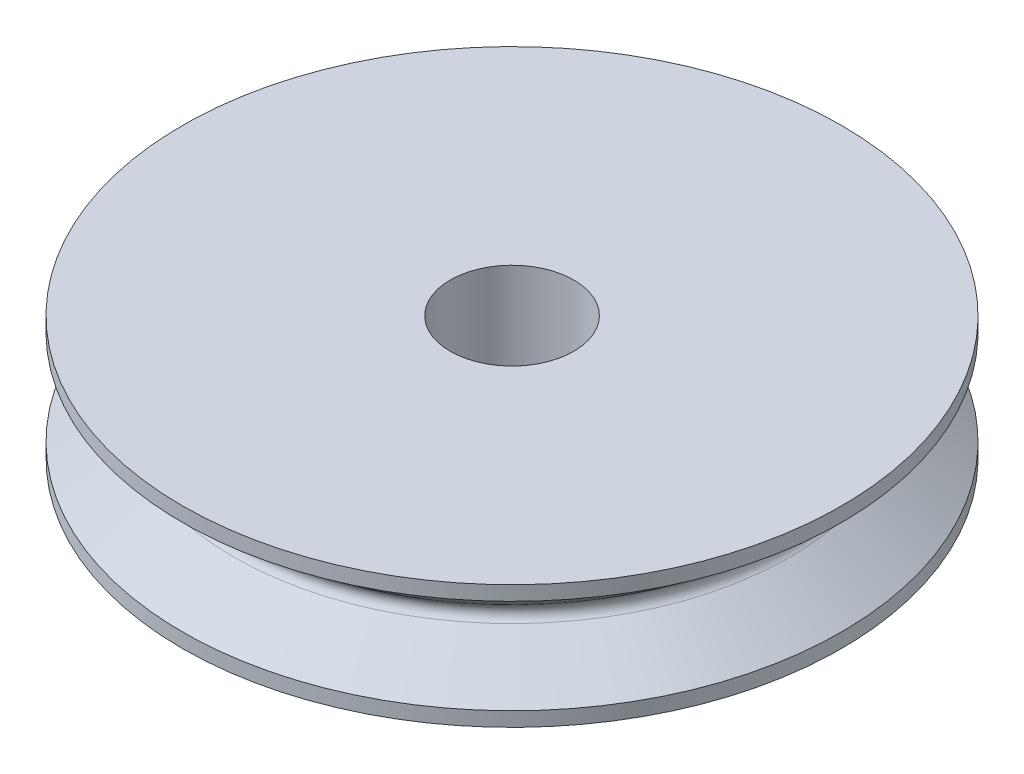
ISO-10303-21;
HEADER;
FILE_DESCRIPTION(('STEP AP214'),'2;1');
FILE_NAME('part.step','',(''),(''),'','','');
FILE_SCHEMA(('AUTOMOTIVE_DESIGN { 1 0 10303 214 1 1 1 1 }'));
ENDSEC;
DATA;
#1=APPLICATION_CONTEXT('core data for automotive mechanical design processes');
#2=APPLICATION_PROTOCOL_DEFINITION('international standard','automotive_design',2000,#1);
#3=PRODUCT_CONTEXT('',#1,'mechanical');
#4=PRODUCT('Part','Part','',(#3));
#5=PRODUCT_RELATED_PRODUCT_CATEGORY('part','',(#4));
#6=PRODUCT_DEFINITION_FORMATION('','',#4);
#7=PRODUCT_DEFINITION_CONTEXT('part definition',#1,'design');
#8=PRODUCT_DEFINITION('design','',#6,#7);
#9=PRODUCT_DEFINITION_SHAPE('','',#8);
#10=(LENGTH_UNIT() NAMED_UNIT(*) SI_UNIT(.MILLI.,.METRE.));
#11=(NAMED_UNIT(*) PLANE_ANGLE_UNIT() SI_UNIT($,.RADIAN.));
#12=(NAMED_UNIT(*) SI_UNIT($,.STERADIAN.) SOLID_ANGLE_UNIT());
#13=UNCERTAINTY_MEASURE_WITH_UNIT(LENGTH_MEASURE(1.E-05),#10,'distance_accuracy_value','');
#14=(GEOMETRIC_REPRESENTATION_CONTEXT(3) GLOBAL_UNCERTAINTY_ASSIGNED_CONTEXT((#13)) GLOBAL_UNIT_ASSIGNED_CONTEXT((#10,
#11,#12)) REPRESENTATION_CONTEXT('',''));
#15=CARTESIAN_POINT('',(0.,0.,0.));
#16=DIRECTION('',(0.,0.,1.));
#17=DIRECTION('',(1.,0.,0.));
#18=AXIS2_PLACEMENT_3D('',#15,#16,#17);
#19=CARTESIAN_POINT('',(0.,6.,0.));
#20=DIRECTION('',(0.,-1.,0.));
#21=DIRECTION('',(0.,0.,-1.));
#22=AXIS2_PLACEMENT_3D('',#19,#20,#21);
#23=CYLINDRICAL_SURFACE('',#22,16.);
#24=CARTESIAN_POINT('',(0.,0.7,0.));
#25=DIRECTION('',(0.,-1.,0.));
#26=DIRECTION('',(0.,0.,-1.));
#27=AXIS2_PLACEMENT_3D('',#24,#25,#26);
#28=CIRCLE('',#27,16.);
#29=CARTESIAN_POINT('',(0.,0.7,-16.));
#30=VERTEX_POINT('',#29);
#31=EDGE_CURVE('E39',#30,#30,#28,.T.);
#32=ORIENTED_EDGE('',*,*,#31,.T.);
#33=EDGE_LOOP('',(#32));
#34=FACE_BOUND('',#33,.T.);
#35=CARTESIAN_POINT('',(0.,0.,0.));
#36=DIRECTION('',(0.,1.,0.));
#37=DIRECTION('',(0.,0.,1.));
#38=AXIS2_PLACEMENT_3D('',#35,#36,#37);
#39=CIRCLE('',#38,16.);
#40=CARTESIAN_POINT('',(0.,0.,16.));
#41=VERTEX_POINT('',#40);
#42=EDGE_CURVE('E32',#41,#41,#39,.T.);
#43=ORIENTED_EDGE('',*,*,#42,.T.);
#44=EDGE_LOOP('',(#43));
#45=FACE_BOUND('',#44,.T.);
#46=ADVANCED_FACE('F28',(#34,#45),#23,.T.);
#47=CARTESIAN_POINT('',(0.,0.,0.));
#48=DIRECTION('',(0.,1.,0.));
#49=DIRECTION('',(0.,0.,1.));
#50=AXIS2_PLACEMENT_3D('',#47,#48,#49);
#51=PLANE('',#50);
#52=CARTESIAN_POINT('',(0.,0.,0.));
#53=DIRECTION('',(0.,1.,0.));
#54=DIRECTION('',(0.,0.,1.));
#55=AXIS2_PLACEMENT_3D('',#52,#53,#54);
#56=CIRCLE('',#55,3.);
#57=CARTESIAN_POINT('',(0.,0.,3.));
#58=VERTEX_POINT('',#57);
#59=EDGE_CURVE('E52',#58,#58,#56,.T.);
#60=ORIENTED_EDGE('',*,*,#59,.T.);
#61=EDGE_LOOP('',(#60));
#62=FACE_BOUND('',#61,.T.);
#63=ORIENTED_EDGE('',*,*,#42,.F.);
#64=EDGE_LOOP('',(#63));
#65=FACE_BOUND('',#64,.T.);
#66=ADVANCED_FACE('F59',(#62,#65),#51,.F.);
#67=CARTESIAN_POINT('',(0.,2.60261236958771,0.));
#68=DIRECTION('',(0.,-1.,0.));
#69=DIRECTION('',(0.,0.,-1.));
#70=AXIS2_PLACEMENT_3D('',#67,#68,#69);
#71=CONICAL_SURFACE('',#70,13.5084204212445,0.918637185248335);
#72=ORIENTED_EDGE('',*,*,#31,.F.);
#73=EDGE_LOOP('',(#72));
#74=FACE_BOUND('',#73,.T.);
#75=CARTESIAN_POINT('',(0.,2.60261236958771,0.));
#76=DIRECTION('',(0.,-1.,0.));
#77=DIRECTION('',(0.,0.,-1.));
#78=AXIS2_PLACEMENT_3D('',#75,#76,#77);
#79=CIRCLE('',#78,13.5084204212445);
#80=CARTESIAN_POINT('',(0.,2.60261236958771,-13.5084204212445));
#81=VERTEX_POINT('',#80);
#82=EDGE_CURVE('E43',#81,#81,#79,.T.);
#83=ORIENTED_EDGE('',*,*,#82,.T.);
#84=EDGE_LOOP('',(#83));
#85=FACE_BOUND('',#84,.T.);
#86=ADVANCED_FACE('F86',(#74,#85),#71,.T.);
#87=CARTESIAN_POINT('',(0.,3.,0.));
#88=DIRECTION('',(0.,-1.,0.));
#89=DIRECTION('',(0.,0.,-1.));
#90=AXIS2_PLACEMENT_3D('',#87,#88,#89);
#91=TOROIDAL_SURFACE('',#90,13.8118723469186,0.5);
#92=ORIENTED_EDGE('',*,*,#82,.F.);
#93=EDGE_LOOP('',(#92));
#94=FACE_BOUND('',#93,.T.);
#95=CARTESIAN_POINT('',(0.,3.39738763041229,0.));
#96=DIRECTION('',(0.,-1.,0.));
#97=DIRECTION('',(0.,0.,-1.));
#98=AXIS2_PLACEMENT_3D('',#95,#96,#97);
#99=CIRCLE('',#98,13.5084204212445);
#100=CARTESIAN_POINT('',(0.,3.39738763041229,-13.5084204212445));
#101=VERTEX_POINT('',#100);
#102=EDGE_CURVE('E46',#101,#101,#99,.T.);
#103=ORIENTED_EDGE('',*,*,#102,.T.);
#104=EDGE_LOOP('',(#103));
#105=FACE_BOUND('',#104,.T.);
#106=ADVANCED_FACE('F77',(#94,#105),#91,.F.);
#107=CARTESIAN_POINT('',(0.,5.3,0.));
#108=DIRECTION('',(0.,1.,0.));
#109=DIRECTION('',(0.,0.,1.));
#110=AXIS2_PLACEMENT_3D('',#107,#108,#109);
#111=CONICAL_SURFACE('',#110,16.,0.918637185248335);
#112=ORIENTED_EDGE('',*,*,#102,.F.);
#113=EDGE_LOOP('',(#112));
#114=FACE_BOUND('',#113,.T.);
#115=CARTESIAN_POINT('',(0.,5.3,0.));
#116=DIRECTION('',(0.,-1.,0.));
#117=DIRECTION('',(0.,0.,-1.));
#118=AXIS2_PLACEMENT_3D('',#115,#116,#117);
#119=CIRCLE('',#118,16.);
#120=CARTESIAN_POINT('',(0.,5.3,-16.));
#121=VERTEX_POINT('',#120);
#122=EDGE_CURVE('E49',#121,#121,#119,.T.);
#123=ORIENTED_EDGE('',*,*,#122,.T.);
#124=EDGE_LOOP('',(#123));
#125=FACE_BOUND('',#124,.T.);
#126=ADVANCED_FACE('F70',(#114,#125),#111,.T.);
#127=CARTESIAN_POINT('',(0.,6.,0.));
#128=DIRECTION('',(0.,1.,0.));
#129=DIRECTION('',(0.,0.,1.));
#130=AXIS2_PLACEMENT_3D('',#127,#128,#129);
#131=PLANE('',#130);
#132=CARTESIAN_POINT('',(0.,6.,0.));
#133=DIRECTION('',(0.,1.,0.));
#134=DIRECTION('',(0.,0.,1.));
#135=AXIS2_PLACEMENT_3D('',#132,#133,#134);
#136=CIRCLE('',#135,3.);
#137=CARTESIAN_POINT('',(0.,6.,3.));
#138=VERTEX_POINT('',#137);
#139=EDGE_CURVE('E53',#138,#138,#136,.T.);
#140=ORIENTED_EDGE('',*,*,#139,.F.);
#141=EDGE_LOOP('',(#140));
#142=FACE_BOUND('',#141,.T.);
#143=CARTESIAN_POINT('',(0.,6.,0.));
#144=DIRECTION('',(0.,1.,0.));
#145=DIRECTION('',(0.,0.,1.));
#146=AXIS2_PLACEMENT_3D('',#143,#144,#145);
#147=CIRCLE('',#146,16.);
#148=CARTESIAN_POINT('',(0.,6.,16.));
#149=VERTEX_POINT('',#148);
#150=EDGE_CURVE('E10',#149,#149,#147,.T.);
#151=ORIENTED_EDGE('',*,*,#150,.T.);
#152=EDGE_LOOP('',(#151));
#153=FACE_BOUND('',#152,.T.);
#154=ADVANCED_FACE('F68',(#142,#153),#131,.T.);
#155=ORIENTED_EDGE('',*,*,#122,.F.);
#156=EDGE_LOOP('',(#155));
#157=FACE_BOUND('',#156,.T.);
#158=ORIENTED_EDGE('',*,*,#150,.F.);
#159=EDGE_LOOP('',(#158));
#160=FACE_BOUND('',#159,.T.);
#161=ADVANCED_FACE('F30',(#157,#160),#23,.T.);
#162=CARTESIAN_POINT('',(0.,0.,0.));
#163=DIRECTION('',(0.,1.,0.));
#164=DIRECTION('',(0.,0.,1.));
#165=AXIS2_PLACEMENT_3D('',#162,#163,#164);
#166=CYLINDRICAL_SURFACE('',#165,3.);
#167=ORIENTED_EDGE('',*,*,#59,.F.);
#168=EDGE_LOOP('',(#167));
#169=FACE_BOUND('',#168,.T.);
#170=ORIENTED_EDGE('',*,*,#139,.T.);
#171=EDGE_LOOP('',(#170));
#172=FACE_BOUND('',#171,.T.);
#173=ADVANCED_FACE('F62',(#169,#172),#166,.F.);
#174=CLOSED_SHELL('',(#46,#66,#86,#106,#126,#154,#161,#173));
#175=MANIFOLD_SOLID_BREP('B2',#174);
#176=ADVANCED_BREP_SHAPE_REPRESENTATION('',(#18,#175),#14);
#177=SHAPE_DEFINITION_REPRESENTATION(#9,#176);
ENDSEC;
END-ISO-10303-21;
